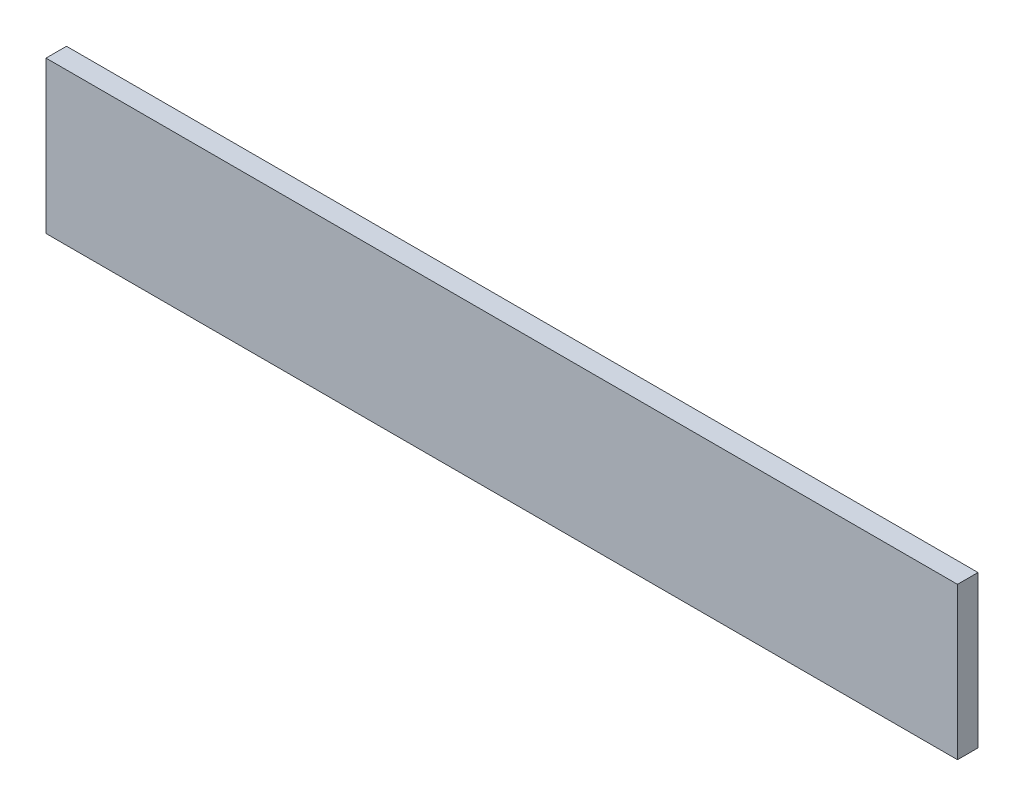
ISO-10303-21;
HEADER;
FILE_DESCRIPTION(('STEP AP214'),'2;1');
FILE_NAME('part.step','',(''),(''),'','','');
FILE_SCHEMA(('AUTOMOTIVE_DESIGN { 1 0 10303 214 1 1 1 1 }'));
ENDSEC;
DATA;
#1=APPLICATION_CONTEXT('core data for automotive mechanical design processes');
#2=APPLICATION_PROTOCOL_DEFINITION('international standard','automotive_design',2000,#1);
#3=PRODUCT_CONTEXT('',#1,'mechanical');
#4=PRODUCT('Part','Part','',(#3));
#5=PRODUCT_RELATED_PRODUCT_CATEGORY('part','',(#4));
#6=PRODUCT_DEFINITION_FORMATION('','',#4);
#7=PRODUCT_DEFINITION_CONTEXT('part definition',#1,'design');
#8=PRODUCT_DEFINITION('design','',#6,#7);
#9=PRODUCT_DEFINITION_SHAPE('','',#8);
#10=(LENGTH_UNIT() NAMED_UNIT(*) SI_UNIT(.MILLI.,.METRE.));
#11=(NAMED_UNIT(*) PLANE_ANGLE_UNIT() SI_UNIT($,.RADIAN.));
#12=(NAMED_UNIT(*) SI_UNIT($,.STERADIAN.) SOLID_ANGLE_UNIT());
#13=UNCERTAINTY_MEASURE_WITH_UNIT(LENGTH_MEASURE(1.E-05),#10,'distance_accuracy_value','');
#14=(GEOMETRIC_REPRESENTATION_CONTEXT(3) GLOBAL_UNCERTAINTY_ASSIGNED_CONTEXT((#13)) GLOBAL_UNIT_ASSIGNED_CONTEXT((#10,
#11,#12)) REPRESENTATION_CONTEXT('',''));
#15=CARTESIAN_POINT('',(0.,0.,0.));
#16=DIRECTION('',(0.,0.,1.));
#17=DIRECTION('',(1.,0.,0.));
#18=AXIS2_PLACEMENT_3D('',#15,#16,#17);
#19=CARTESIAN_POINT('',(0.,0.,27.));
#20=DIRECTION('',(1.,0.,0.));
#21=DIRECTION('',(0.,0.,-1.));
#22=AXIS2_PLACEMENT_3D('',#19,#20,#21);
#23=PLANE('',#22);
#24=DIRECTION('',(0.,-1.,0.));
#25=VECTOR('',#24,1.);
#26=CARTESIAN_POINT('',(0.,0.,0.));
#27=LINE('',#26,#25);
#28=CARTESIAN_POINT('',(0.,200.,0.));
#29=VERTEX_POINT('',#28);
#30=CARTESIAN_POINT('',(0.,0.,0.));
#31=VERTEX_POINT('',#30);
#32=EDGE_CURVE('E95',#29,#31,#27,.T.);
#33=ORIENTED_EDGE('',*,*,#32,.T.);
#34=DIRECTION('',(0.,0.,-1.));
#35=VECTOR('',#34,1.);
#36=CARTESIAN_POINT('',(0.,0.,27.));
#37=LINE('',#36,#35);
#38=CARTESIAN_POINT('',(0.,0.,27.));
#39=VERTEX_POINT('',#38);
#40=EDGE_CURVE('E11',#39,#31,#37,.T.);
#41=ORIENTED_EDGE('',*,*,#40,.F.);
#42=DIRECTION('',(0.,-1.,0.));
#43=VECTOR('',#42,1.);
#44=CARTESIAN_POINT('',(0.,0.,27.));
#45=LINE('',#44,#43);
#46=CARTESIAN_POINT('',(0.,200.,27.));
#47=VERTEX_POINT('',#46);
#48=EDGE_CURVE('E83',#47,#39,#45,.T.);
#49=ORIENTED_EDGE('',*,*,#48,.F.);
#50=DIRECTION('',(0.,0.,-1.));
#51=VECTOR('',#50,1.);
#52=CARTESIAN_POINT('',(0.,200.,27.));
#53=LINE('',#52,#51);
#54=EDGE_CURVE('E91',#47,#29,#53,.T.);
#55=ORIENTED_EDGE('',*,*,#54,.T.);
#56=EDGE_LOOP('',(#33,#41,#49,#55));
#57=FACE_BOUND('',#56,.T.);
#58=ADVANCED_FACE('F32',(#57),#23,.F.);
#59=CARTESIAN_POINT('',(0.,0.,27.));
#60=DIRECTION('',(0.,1.,0.));
#61=DIRECTION('',(0.,0.,1.));
#62=AXIS2_PLACEMENT_3D('',#59,#60,#61);
#63=PLANE('',#62);
#64=DIRECTION('',(1.,0.,0.));
#65=VECTOR('',#64,1.);
#66=CARTESIAN_POINT('',(0.,0.,0.));
#67=LINE('',#66,#65);
#68=CARTESIAN_POINT('',(1200.,0.,0.));
#69=VERTEX_POINT('',#68);
#70=EDGE_CURVE('E87',#31,#69,#67,.T.);
#71=ORIENTED_EDGE('',*,*,#70,.T.);
#72=DIRECTION('',(0.,0.,-1.));
#73=VECTOR('',#72,1.);
#74=CARTESIAN_POINT('',(1200.,0.,27.));
#75=LINE('',#74,#73);
#76=CARTESIAN_POINT('',(1200.,0.,27.));
#77=VERTEX_POINT('',#76);
#78=EDGE_CURVE('E40',#77,#69,#75,.T.);
#79=ORIENTED_EDGE('',*,*,#78,.F.);
#80=DIRECTION('',(1.,0.,0.));
#81=VECTOR('',#80,1.);
#82=CARTESIAN_POINT('',(0.,0.,27.));
#83=LINE('',#82,#81);
#84=EDGE_CURVE('E78',#39,#77,#83,.T.);
#85=ORIENTED_EDGE('',*,*,#84,.F.);
#86=ORIENTED_EDGE('',*,*,#40,.T.);
#87=EDGE_LOOP('',(#71,#79,#85,#86));
#88=FACE_BOUND('',#87,.T.);
#89=ADVANCED_FACE('F86',(#88),#63,.F.);
#90=CARTESIAN_POINT('',(1200.,0.,27.));
#91=DIRECTION('',(-1.,0.,0.));
#92=DIRECTION('',(0.,0.,1.));
#93=AXIS2_PLACEMENT_3D('',#90,#91,#92);
#94=PLANE('',#93);
#95=DIRECTION('',(0.,1.,0.));
#96=VECTOR('',#95,1.);
#97=CARTESIAN_POINT('',(1200.,0.,0.));
#98=LINE('',#97,#96);
#99=CARTESIAN_POINT('',(1200.,200.,0.));
#100=VERTEX_POINT('',#99);
#101=EDGE_CURVE('E65',#69,#100,#98,.T.);
#102=ORIENTED_EDGE('',*,*,#101,.T.);
#103=DIRECTION('',(0.,0.,-1.));
#104=VECTOR('',#103,1.);
#105=CARTESIAN_POINT('',(1200.,200.,27.));
#106=LINE('',#105,#104);
#107=CARTESIAN_POINT('',(1200.,200.,27.));
#108=VERTEX_POINT('',#107);
#109=EDGE_CURVE('E88',#108,#100,#106,.T.);
#110=ORIENTED_EDGE('',*,*,#109,.F.);
#111=DIRECTION('',(0.,1.,0.));
#112=VECTOR('',#111,1.);
#113=CARTESIAN_POINT('',(1200.,0.,27.));
#114=LINE('',#113,#112);
#115=EDGE_CURVE('E81',#77,#108,#114,.T.);
#116=ORIENTED_EDGE('',*,*,#115,.F.);
#117=ORIENTED_EDGE('',*,*,#78,.T.);
#118=EDGE_LOOP('',(#102,#110,#116,#117));
#119=FACE_BOUND('',#118,.T.);
#120=ADVANCED_FACE('F89',(#119),#94,.F.);
#121=CARTESIAN_POINT('',(0.,200.,27.));
#122=DIRECTION('',(0.,-1.,0.));
#123=DIRECTION('',(0.,0.,-1.));
#124=AXIS2_PLACEMENT_3D('',#121,#122,#123);
#125=PLANE('',#124);
#126=DIRECTION('',(-1.,0.,0.));
#127=VECTOR('',#126,1.);
#128=CARTESIAN_POINT('',(0.,200.,0.));
#129=LINE('',#128,#127);
#130=EDGE_CURVE('E71',#100,#29,#129,.T.);
#131=ORIENTED_EDGE('',*,*,#130,.T.);
#132=ORIENTED_EDGE('',*,*,#54,.F.);
#133=DIRECTION('',(-1.,0.,0.));
#134=VECTOR('',#133,1.);
#135=CARTESIAN_POINT('',(0.,200.,27.));
#136=LINE('',#135,#134);
#137=EDGE_CURVE('E48',#108,#47,#136,.T.);
#138=ORIENTED_EDGE('',*,*,#137,.F.);
#139=ORIENTED_EDGE('',*,*,#109,.T.);
#140=EDGE_LOOP('',(#131,#132,#138,#139));
#141=FACE_BOUND('',#140,.T.);
#142=ADVANCED_FACE('F102',(#141),#125,.F.);
#143=CARTESIAN_POINT('',(0.,0.,27.));
#144=DIRECTION('',(0.,0.,-1.));
#145=DIRECTION('',(-1.,0.,0.));
#146=AXIS2_PLACEMENT_3D('',#143,#144,#145);
#147=PLANE('',#146);
#148=ORIENTED_EDGE('',*,*,#48,.T.);
#149=ORIENTED_EDGE('',*,*,#84,.T.);
#150=ORIENTED_EDGE('',*,*,#115,.T.);
#151=ORIENTED_EDGE('',*,*,#137,.T.);
#152=EDGE_LOOP('',(#148,#149,#150,#151));
#153=FACE_BOUND('',#152,.T.);
#154=ADVANCED_FACE('F79',(#153),#147,.F.);
#155=CARTESIAN_POINT('',(0.,0.,0.));
#156=DIRECTION('',(0.,0.,-1.));
#157=DIRECTION('',(-1.,0.,0.));
#158=AXIS2_PLACEMENT_3D('',#155,#156,#157);
#159=PLANE('',#158);
#160=ORIENTED_EDGE('',*,*,#32,.F.);
#161=ORIENTED_EDGE('',*,*,#130,.F.);
#162=ORIENTED_EDGE('',*,*,#101,.F.);
#163=ORIENTED_EDGE('',*,*,#70,.F.);
#164=EDGE_LOOP('',(#160,#161,#162,#163));
#165=FACE_BOUND('',#164,.T.);
#166=ADVANCED_FACE('F105',(#165),#159,.T.);
#167=CLOSED_SHELL('',(#58,#89,#120,#142,#154,#166));
#168=MANIFOLD_SOLID_BREP('B2',#167);
#169=ADVANCED_BREP_SHAPE_REPRESENTATION('',(#18,#168),#14);
#170=SHAPE_DEFINITION_REPRESENTATION(#9,#169);
ENDSEC;
END-ISO-10303-21;
